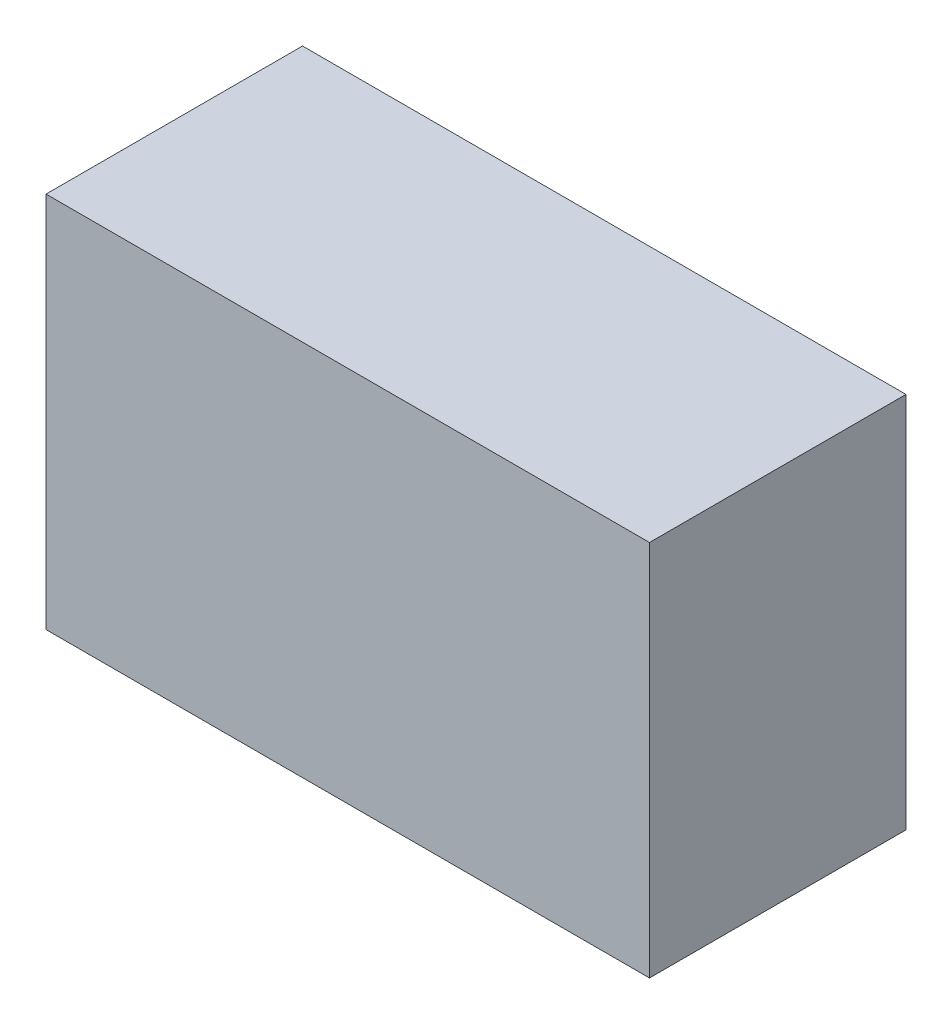
ISO-10303-21;
HEADER;
FILE_DESCRIPTION(('STEP AP214'),'2;1');
FILE_NAME('part.step','',(''),(''),'','','');
FILE_SCHEMA(('AUTOMOTIVE_DESIGN { 1 0 10303 214 1 1 1 1 }'));
ENDSEC;
DATA;
#1=APPLICATION_CONTEXT('core data for automotive mechanical design processes');
#2=APPLICATION_PROTOCOL_DEFINITION('international standard','automotive_design',2000,#1);
#3=PRODUCT_CONTEXT('',#1,'mechanical');
#4=PRODUCT('Part','Part','',(#3));
#5=PRODUCT_RELATED_PRODUCT_CATEGORY('part','',(#4));
#6=PRODUCT_DEFINITION_FORMATION('','',#4);
#7=PRODUCT_DEFINITION_CONTEXT('part definition',#1,'design');
#8=PRODUCT_DEFINITION('design','',#6,#7);
#9=PRODUCT_DEFINITION_SHAPE('','',#8);
#10=(LENGTH_UNIT() NAMED_UNIT(*) SI_UNIT(.MILLI.,.METRE.));
#11=(NAMED_UNIT(*) PLANE_ANGLE_UNIT() SI_UNIT($,.RADIAN.));
#12=(NAMED_UNIT(*) SI_UNIT($,.STERADIAN.) SOLID_ANGLE_UNIT());
#13=UNCERTAINTY_MEASURE_WITH_UNIT(LENGTH_MEASURE(1.E-05),#10,'distance_accuracy_value','');
#14=(GEOMETRIC_REPRESENTATION_CONTEXT(3) GLOBAL_UNCERTAINTY_ASSIGNED_CONTEXT((#13)) GLOBAL_UNIT_ASSIGNED_CONTEXT((#10,
#11,#12)) REPRESENTATION_CONTEXT('',''));
#15=CARTESIAN_POINT('',(0.,0.,0.));
#16=DIRECTION('',(0.,0.,1.));
#17=DIRECTION('',(1.,0.,0.));
#18=AXIS2_PLACEMENT_3D('',#15,#16,#17);
#19=CARTESIAN_POINT('',(0.,0.,0.85));
#20=DIRECTION('',(0.,0.,1.));
#21=DIRECTION('',(1.,0.,0.));
#22=AXIS2_PLACEMENT_3D('',#19,#20,#21);
#23=PLANE('',#22);
#24=DIRECTION('',(0.,1.,0.));
#25=VECTOR('',#24,1.);
#26=CARTESIAN_POINT('',(0.,1.25,0.85));
#27=LINE('',#26,#25);
#28=CARTESIAN_POINT('',(0.,0.,0.85));
#29=VERTEX_POINT('',#28);
#30=CARTESIAN_POINT('',(0.,1.25,0.85));
#31=VERTEX_POINT('',#30);
#32=EDGE_CURVE('E57',#29,#31,#27,.T.);
#33=ORIENTED_EDGE('',*,*,#32,.F.);
#34=DIRECTION('',(1.,0.,0.));
#35=VECTOR('',#34,1.);
#36=CARTESIAN_POINT('',(0.,0.,0.85));
#37=LINE('',#36,#35);
#38=CARTESIAN_POINT('',(2.,0.,0.85));
#39=VERTEX_POINT('',#38);
#40=EDGE_CURVE('E52',#39,#29,#37,.F.);
#41=ORIENTED_EDGE('',*,*,#40,.F.);
#42=DIRECTION('',(0.,1.,0.));
#43=VECTOR('',#42,1.);
#44=CARTESIAN_POINT('',(2.,0.,0.85));
#45=LINE('',#44,#43);
#46=CARTESIAN_POINT('',(2.,1.25,0.85));
#47=VERTEX_POINT('',#46);
#48=EDGE_CURVE('E19',#39,#47,#45,.T.);
#49=ORIENTED_EDGE('',*,*,#48,.T.);
#50=DIRECTION('',(1.,0.,0.));
#51=VECTOR('',#50,1.);
#52=CARTESIAN_POINT('',(2.,1.25,0.85));
#53=LINE('',#52,#51);
#54=EDGE_CURVE('E66',#31,#47,#53,.T.);
#55=ORIENTED_EDGE('',*,*,#54,.F.);
#56=EDGE_LOOP('',(#33,#41,#49,#55));
#57=FACE_BOUND('',#56,.T.);
#58=ADVANCED_FACE('F16',(#57),#23,.T.);
#59=CARTESIAN_POINT('',(2.,1.25,0.));
#60=DIRECTION('',(0.,1.,0.));
#61=DIRECTION('',(0.,0.,1.));
#62=AXIS2_PLACEMENT_3D('',#59,#60,#61);
#63=PLANE('',#62);
#64=DIRECTION('',(0.,0.,-1.));
#65=VECTOR('',#64,1.);
#66=CARTESIAN_POINT('',(2.,1.25,0.));
#67=LINE('',#66,#65);
#68=CARTESIAN_POINT('',(2.,1.25,0.));
#69=VERTEX_POINT('',#68);
#70=EDGE_CURVE('E79',#69,#47,#67,.F.);
#71=ORIENTED_EDGE('',*,*,#70,.F.);
#72=DIRECTION('',(1.,0.,0.));
#73=VECTOR('',#72,1.);
#74=CARTESIAN_POINT('',(0.,1.25,0.));
#75=LINE('',#74,#73);
#76=CARTESIAN_POINT('',(0.,1.25,0.));
#77=VERTEX_POINT('',#76);
#78=EDGE_CURVE('E74',#69,#77,#75,.F.);
#79=ORIENTED_EDGE('',*,*,#78,.T.);
#80=DIRECTION('',(0.,0.,1.));
#81=VECTOR('',#80,1.);
#82=CARTESIAN_POINT('',(0.,1.25,0.));
#83=LINE('',#82,#81);
#84=EDGE_CURVE('E62',#31,#77,#83,.F.);
#85=ORIENTED_EDGE('',*,*,#84,.F.);
#86=ORIENTED_EDGE('',*,*,#54,.T.);
#87=EDGE_LOOP('',(#71,#79,#85,#86));
#88=FACE_BOUND('',#87,.T.);
#89=ADVANCED_FACE('F73',(#88),#63,.T.);
#90=CARTESIAN_POINT('',(0.,1.25,0.));
#91=DIRECTION('',(-1.,0.,0.));
#92=DIRECTION('',(0.,0.,1.));
#93=AXIS2_PLACEMENT_3D('',#90,#91,#92);
#94=PLANE('',#93);
#95=ORIENTED_EDGE('',*,*,#84,.T.);
#96=DIRECTION('',(0.,1.,0.));
#97=VECTOR('',#96,1.);
#98=CARTESIAN_POINT('',(0.,0.,0.));
#99=LINE('',#98,#97);
#100=CARTESIAN_POINT('',(0.,0.,0.));
#101=VERTEX_POINT('',#100);
#102=EDGE_CURVE('E83',#77,#101,#99,.F.);
#103=ORIENTED_EDGE('',*,*,#102,.T.);
#104=DIRECTION('',(0.,0.,-1.));
#105=VECTOR('',#104,1.);
#106=CARTESIAN_POINT('',(0.,0.,0.));
#107=LINE('',#106,#105);
#108=EDGE_CURVE('E64',#29,#101,#107,.T.);
#109=ORIENTED_EDGE('',*,*,#108,.F.);
#110=ORIENTED_EDGE('',*,*,#32,.T.);
#111=EDGE_LOOP('',(#95,#103,#109,#110));
#112=FACE_BOUND('',#111,.T.);
#113=ADVANCED_FACE('F59',(#112),#94,.T.);
#114=CARTESIAN_POINT('',(0.,0.,0.));
#115=DIRECTION('',(0.,-1.,0.));
#116=DIRECTION('',(0.,0.,-1.));
#117=AXIS2_PLACEMENT_3D('',#114,#115,#116);
#118=PLANE('',#117);
#119=ORIENTED_EDGE('',*,*,#108,.T.);
#120=DIRECTION('',(1.,0.,0.));
#121=VECTOR('',#120,1.);
#122=CARTESIAN_POINT('',(0.,0.,0.));
#123=LINE('',#122,#121);
#124=CARTESIAN_POINT('',(2.,0.,0.));
#125=VERTEX_POINT('',#124);
#126=EDGE_CURVE('E25',#101,#125,#123,.T.);
#127=ORIENTED_EDGE('',*,*,#126,.T.);
#128=DIRECTION('',(0.,0.,-1.));
#129=VECTOR('',#128,1.);
#130=CARTESIAN_POINT('',(2.,0.,0.));
#131=LINE('',#130,#129);
#132=EDGE_CURVE('E33',#39,#125,#131,.T.);
#133=ORIENTED_EDGE('',*,*,#132,.F.);
#134=ORIENTED_EDGE('',*,*,#40,.T.);
#135=EDGE_LOOP('',(#119,#127,#133,#134));
#136=FACE_BOUND('',#135,.T.);
#137=ADVANCED_FACE('F87',(#136),#118,.T.);
#138=CARTESIAN_POINT('',(2.,0.,0.));
#139=DIRECTION('',(1.,0.,0.));
#140=DIRECTION('',(0.,0.,-1.));
#141=AXIS2_PLACEMENT_3D('',#138,#139,#140);
#142=PLANE('',#141);
#143=ORIENTED_EDGE('',*,*,#132,.T.);
#144=DIRECTION('',(0.,1.,0.));
#145=VECTOR('',#144,1.);
#146=CARTESIAN_POINT('',(2.,0.,0.));
#147=LINE('',#146,#145);
#148=EDGE_CURVE('E11',#125,#69,#147,.T.);
#149=ORIENTED_EDGE('',*,*,#148,.T.);
#150=ORIENTED_EDGE('',*,*,#70,.T.);
#151=ORIENTED_EDGE('',*,*,#48,.F.);
#152=EDGE_LOOP('',(#143,#149,#150,#151));
#153=FACE_BOUND('',#152,.T.);
#154=ADVANCED_FACE('F90',(#153),#142,.T.);
#155=CARTESIAN_POINT('',(0.,0.,0.));
#156=DIRECTION('',(0.,0.,1.));
#157=DIRECTION('',(1.,0.,0.));
#158=AXIS2_PLACEMENT_3D('',#155,#156,#157);
#159=PLANE('',#158);
#160=ORIENTED_EDGE('',*,*,#126,.F.);
#161=ORIENTED_EDGE('',*,*,#102,.F.);
#162=ORIENTED_EDGE('',*,*,#78,.F.);
#163=ORIENTED_EDGE('',*,*,#148,.F.);
#164=EDGE_LOOP('',(#160,#161,#162,#163));
#165=FACE_BOUND('',#164,.T.);
#166=ADVANCED_FACE('F89',(#165),#159,.F.);
#167=CLOSED_SHELL('',(#58,#89,#113,#137,#154,#166));
#168=MANIFOLD_SOLID_BREP('B1',#167);
#169=ADVANCED_BREP_SHAPE_REPRESENTATION('',(#18,#168),#14);
#170=SHAPE_DEFINITION_REPRESENTATION(#9,#169);
ENDSEC;
END-ISO-10303-21;
